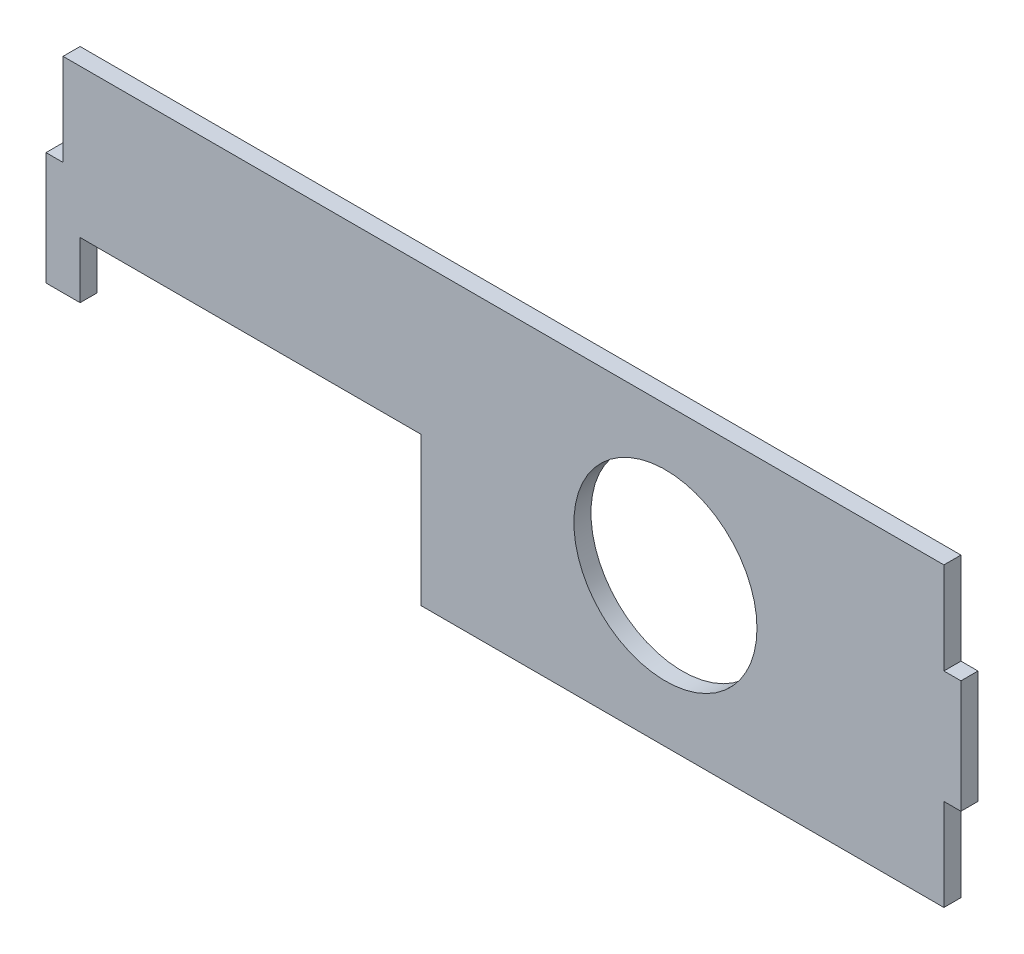
ISO-10303-21;
HEADER;
FILE_DESCRIPTION(('STEP AP214'),'2;1');
FILE_NAME('part.step','',(''),(''),'','','');
FILE_SCHEMA(('AUTOMOTIVE_DESIGN { 1 0 10303 214 1 1 1 1 }'));
ENDSEC;
DATA;
#1=APPLICATION_CONTEXT('core data for automotive mechanical design processes');
#2=APPLICATION_PROTOCOL_DEFINITION('international standard','automotive_design',2000,#1);
#3=PRODUCT_CONTEXT('',#1,'mechanical');
#4=PRODUCT('Part','Part','',(#3));
#5=PRODUCT_RELATED_PRODUCT_CATEGORY('part','',(#4));
#6=PRODUCT_DEFINITION_FORMATION('','',#4);
#7=PRODUCT_DEFINITION_CONTEXT('part definition',#1,'design');
#8=PRODUCT_DEFINITION('design','',#6,#7);
#9=PRODUCT_DEFINITION_SHAPE('','',#8);
#10=(LENGTH_UNIT() NAMED_UNIT(*) SI_UNIT(.MILLI.,.METRE.));
#11=(NAMED_UNIT(*) PLANE_ANGLE_UNIT() SI_UNIT($,.RADIAN.));
#12=(NAMED_UNIT(*) SI_UNIT($,.STERADIAN.) SOLID_ANGLE_UNIT());
#13=UNCERTAINTY_MEASURE_WITH_UNIT(LENGTH_MEASURE(1.E-05),#10,'distance_accuracy_value','');
#14=(GEOMETRIC_REPRESENTATION_CONTEXT(3) GLOBAL_UNCERTAINTY_ASSIGNED_CONTEXT((#13)) GLOBAL_UNIT_ASSIGNED_CONTEXT((#10,
#11,#12)) REPRESENTATION_CONTEXT('',''));
#15=CARTESIAN_POINT('',(0.,0.,0.));
#16=DIRECTION('',(0.,0.,1.));
#17=DIRECTION('',(1.,0.,0.));
#18=AXIS2_PLACEMENT_3D('',#15,#16,#17);
#19=CARTESIAN_POINT('',(192.200000000003,95.000000000001,3.));
#20=DIRECTION('',(0.,0.,1.));
#21=DIRECTION('',(1.,0.,0.));
#22=AXIS2_PLACEMENT_3D('',#19,#20,#21);
#23=PLANE('',#22);
#24=DIRECTION('',(1.,0.,0.));
#25=VECTOR('',#24,1.);
#26=CARTESIAN_POINT('',(136.990197314587,644.611734835916,3.));
#27=LINE('',#26,#25);
#28=CARTESIAN_POINT('',(136.990197314587,644.611734835916,3.));
#29=VERTEX_POINT('',#28);
#30=CARTESIAN_POINT('',(142.990197314587,644.611734835916,3.));
#31=VERTEX_POINT('',#30);
#32=EDGE_CURVE('E152',#29,#31,#27,.T.);
#33=ORIENTED_EDGE('',*,*,#32,.T.);
#34=DIRECTION('',(0.,-1.,0.));
#35=VECTOR('',#34,1.);
#36=CARTESIAN_POINT('',(142.990197314587,644.611734835916,3.));
#37=LINE('',#36,#35);
#38=CARTESIAN_POINT('',(142.990197314587,654.551734835916,3.));
#39=VERTEX_POINT('',#38);
#40=EDGE_CURVE('E228',#39,#31,#37,.T.);
#41=ORIENTED_EDGE('',*,*,#40,.F.);
#42=DIRECTION('',(-1.,0.,0.));
#43=VECTOR('',#42,1.);
#44=CARTESIAN_POINT('',(142.990197314587,654.551734835916,3.));
#45=LINE('',#44,#43);
#46=CARTESIAN_POINT('',(202.990197314587,654.551734835916,3.));
#47=VERTEX_POINT('',#46);
#48=EDGE_CURVE('E233',#47,#39,#45,.T.);
#49=ORIENTED_EDGE('',*,*,#48,.F.);
#50=DIRECTION('',(0.,1.,0.));
#51=VECTOR('',#50,1.);
#52=CARTESIAN_POINT('',(202.990197314587,654.551734835916,3.));
#53=LINE('',#52,#51);
#54=CARTESIAN_POINT('',(202.990197314587,628.444859835916,3.));
#55=VERTEX_POINT('',#54);
#56=EDGE_CURVE('E226',#55,#47,#53,.T.);
#57=ORIENTED_EDGE('',*,*,#56,.F.);
#58=DIRECTION('',(1.,0.,0.));
#59=VECTOR('',#58,1.);
#60=CARTESIAN_POINT('',(294.990197314587,628.444859835916,3.));
#61=LINE('',#60,#59);
#62=CARTESIAN_POINT('',(294.990197314587,628.444859835916,3.));
#63=VERTEX_POINT('',#62);
#64=EDGE_CURVE('E57',#55,#63,#61,.T.);
#65=ORIENTED_EDGE('',*,*,#64,.T.);
#66=DIRECTION('',(0.,1.,0.));
#67=VECTOR('',#66,1.);
#68=CARTESIAN_POINT('',(294.990197314587,628.444859835916,3.));
#69=LINE('',#68,#67);
#70=CARTESIAN_POINT('',(294.990197314587,644.611734835916,3.));
#71=VERTEX_POINT('',#70);
#72=EDGE_CURVE('E182',#63,#71,#69,.T.);
#73=ORIENTED_EDGE('',*,*,#72,.T.);
#74=DIRECTION('',(1.,0.,0.));
#75=VECTOR('',#74,1.);
#76=CARTESIAN_POINT('',(297.990197314587,644.611734835916,3.));
#77=LINE('',#76,#75);
#78=CARTESIAN_POINT('',(297.990197314587,644.611734835916,3.));
#79=VERTEX_POINT('',#78);
#80=EDGE_CURVE('E105',#71,#79,#77,.T.);
#81=ORIENTED_EDGE('',*,*,#80,.T.);
#82=DIRECTION('',(0.,1.,0.));
#83=VECTOR('',#82,1.);
#84=CARTESIAN_POINT('',(297.990197314587,664.491734835916,3.));
#85=LINE('',#84,#83);
#86=CARTESIAN_POINT('',(297.990197314587,664.491734835916,3.));
#87=VERTEX_POINT('',#86);
#88=EDGE_CURVE('E245',#79,#87,#85,.T.);
#89=ORIENTED_EDGE('',*,*,#88,.T.);
#90=DIRECTION('',(-1.,0.,0.));
#91=VECTOR('',#90,1.);
#92=CARTESIAN_POINT('',(294.990197314587,664.491734835916,3.));
#93=LINE('',#92,#91);
#94=CARTESIAN_POINT('',(294.990197314587,664.491734835916,3.));
#95=VERTEX_POINT('',#94);
#96=EDGE_CURVE('E247',#87,#95,#93,.T.);
#97=ORIENTED_EDGE('',*,*,#96,.T.);
#98=DIRECTION('',(0.,1.,0.));
#99=VECTOR('',#98,1.);
#100=CARTESIAN_POINT('',(294.990197314587,664.491734835916,3.));
#101=LINE('',#100,#99);
#102=CARTESIAN_POINT('',(294.990197314587,680.658609835916,3.));
#103=VERTEX_POINT('',#102);
#104=EDGE_CURVE('E249',#95,#103,#101,.T.);
#105=ORIENTED_EDGE('',*,*,#104,.T.);
#106=DIRECTION('',(-1.,0.,0.));
#107=VECTOR('',#106,1.);
#108=CARTESIAN_POINT('',(294.990197314587,680.658609835916,3.));
#109=LINE('',#108,#107);
#110=CARTESIAN_POINT('',(139.990197314587,680.658609835916,3.));
#111=VERTEX_POINT('',#110);
#112=EDGE_CURVE('E251',#103,#111,#109,.T.);
#113=ORIENTED_EDGE('',*,*,#112,.T.);
#114=DIRECTION('',(0.,-1.,0.));
#115=VECTOR('',#114,1.);
#116=CARTESIAN_POINT('',(139.990197314587,664.491734835916,3.));
#117=LINE('',#116,#115);
#118=CARTESIAN_POINT('',(139.990197314587,664.491734835916,3.));
#119=VERTEX_POINT('',#118);
#120=EDGE_CURVE('E134',#111,#119,#117,.T.);
#121=ORIENTED_EDGE('',*,*,#120,.T.);
#122=DIRECTION('',(-1.,0.,0.));
#123=VECTOR('',#122,1.);
#124=CARTESIAN_POINT('',(139.990197314587,664.491734835916,3.));
#125=LINE('',#124,#123);
#126=CARTESIAN_POINT('',(136.990197314587,664.491734835916,3.));
#127=VERTEX_POINT('',#126);
#128=EDGE_CURVE('E126',#119,#127,#125,.T.);
#129=ORIENTED_EDGE('',*,*,#128,.T.);
#130=DIRECTION('',(0.,-1.,0.));
#131=VECTOR('',#130,1.);
#132=CARTESIAN_POINT('',(136.990197314587,664.491734835916,3.));
#133=LINE('',#132,#131);
#134=EDGE_CURVE('E131',#127,#29,#133,.T.);
#135=ORIENTED_EDGE('',*,*,#134,.T.);
#136=EDGE_LOOP('',(#33,#41,#49,#57,#65,#73,#81,#89,#97,#105,#113,#121,#129,#135));
#137=FACE_BOUND('',#136,.T.);
#138=CARTESIAN_POINT('',(245.990197314587,654.551734835916,3.));
#139=DIRECTION('',(0.,0.,1.));
#140=DIRECTION('',(1.,0.,0.));
#141=AXIS2_PLACEMENT_3D('',#138,#139,#140);
#142=CIRCLE('',#141,16.1068750000001);
#143=CARTESIAN_POINT('',(262.097072314587,654.551734835916,3.));
#144=VERTEX_POINT('',#143);
#145=EDGE_CURVE('E163',#144,#144,#142,.T.);
#146=ORIENTED_EDGE('',*,*,#145,.F.);
#147=EDGE_LOOP('',(#146));
#148=FACE_BOUND('',#147,.T.);
#149=ADVANCED_FACE('F33',(#137,#148),#23,.T.);
#150=CARTESIAN_POINT('',(192.200000000003,95.000000000001,0.));
#151=DIRECTION('',(0.,0.,1.));
#152=DIRECTION('',(1.,0.,0.));
#153=AXIS2_PLACEMENT_3D('',#150,#151,#152);
#154=PLANE('',#153);
#155=DIRECTION('',(0.,-1.,0.));
#156=VECTOR('',#155,1.);
#157=CARTESIAN_POINT('',(142.990197314587,95.000000000001,0.));
#158=LINE('',#157,#156);
#159=CARTESIAN_POINT('',(142.990197314587,654.551734835916,0.));
#160=VERTEX_POINT('',#159);
#161=CARTESIAN_POINT('',(142.990197314587,644.611734835916,0.));
#162=VERTEX_POINT('',#161);
#163=EDGE_CURVE('E11',#160,#162,#158,.T.);
#164=ORIENTED_EDGE('',*,*,#163,.T.);
#165=DIRECTION('',(1.,0.,0.));
#166=VECTOR('',#165,1.);
#167=CARTESIAN_POINT('',(136.990197314587,644.611734835916,0.));
#168=LINE('',#167,#166);
#169=CARTESIAN_POINT('',(136.990197314587,644.611734835916,0.));
#170=VERTEX_POINT('',#169);
#171=EDGE_CURVE('E178',#170,#162,#168,.T.);
#172=ORIENTED_EDGE('',*,*,#171,.F.);
#173=DIRECTION('',(0.,-1.,0.));
#174=VECTOR('',#173,1.);
#175=CARTESIAN_POINT('',(136.990197314587,664.491734835916,0.));
#176=LINE('',#175,#174);
#177=CARTESIAN_POINT('',(136.990197314587,664.491734835916,0.));
#178=VERTEX_POINT('',#177);
#179=EDGE_CURVE('E176',#178,#170,#176,.T.);
#180=ORIENTED_EDGE('',*,*,#179,.F.);
#181=DIRECTION('',(-1.,0.,0.));
#182=VECTOR('',#181,1.);
#183=CARTESIAN_POINT('',(139.990197314587,664.491734835916,0.));
#184=LINE('',#183,#182);
#185=CARTESIAN_POINT('',(139.990197314587,664.491734835916,0.));
#186=VERTEX_POINT('',#185);
#187=EDGE_CURVE('E143',#186,#178,#184,.T.);
#188=ORIENTED_EDGE('',*,*,#187,.F.);
#189=DIRECTION('',(0.,-1.,0.));
#190=VECTOR('',#189,1.);
#191=CARTESIAN_POINT('',(139.990197314587,664.491734835916,0.));
#192=LINE('',#191,#190);
#193=CARTESIAN_POINT('',(139.990197314587,680.658609835916,0.));
#194=VERTEX_POINT('',#193);
#195=EDGE_CURVE('E173',#194,#186,#192,.T.);
#196=ORIENTED_EDGE('',*,*,#195,.F.);
#197=DIRECTION('',(-1.,0.,0.));
#198=VECTOR('',#197,1.);
#199=CARTESIAN_POINT('',(294.990197314587,680.658609835916,0.));
#200=LINE('',#199,#198);
#201=CARTESIAN_POINT('',(294.990197314587,680.658609835916,0.));
#202=VERTEX_POINT('',#201);
#203=EDGE_CURVE('E171',#202,#194,#200,.T.);
#204=ORIENTED_EDGE('',*,*,#203,.F.);
#205=DIRECTION('',(0.,1.,0.));
#206=VECTOR('',#205,1.);
#207=CARTESIAN_POINT('',(294.990197314587,664.491734835916,0.));
#208=LINE('',#207,#206);
#209=CARTESIAN_POINT('',(294.990197314587,664.491734835916,0.));
#210=VERTEX_POINT('',#209);
#211=EDGE_CURVE('E169',#210,#202,#208,.T.);
#212=ORIENTED_EDGE('',*,*,#211,.F.);
#213=DIRECTION('',(-1.,0.,0.));
#214=VECTOR('',#213,1.);
#215=CARTESIAN_POINT('',(294.990197314587,664.491734835916,0.));
#216=LINE('',#215,#214);
#217=CARTESIAN_POINT('',(297.990197314587,664.491734835916,0.));
#218=VERTEX_POINT('',#217);
#219=EDGE_CURVE('E167',#218,#210,#216,.T.);
#220=ORIENTED_EDGE('',*,*,#219,.F.);
#221=DIRECTION('',(0.,1.,0.));
#222=VECTOR('',#221,1.);
#223=CARTESIAN_POINT('',(297.990197314587,664.491734835916,0.));
#224=LINE('',#223,#222);
#225=CARTESIAN_POINT('',(297.990197314587,644.611734835916,0.));
#226=VERTEX_POINT('',#225);
#227=EDGE_CURVE('E165',#226,#218,#224,.T.);
#228=ORIENTED_EDGE('',*,*,#227,.F.);
#229=DIRECTION('',(1.,0.,0.));
#230=VECTOR('',#229,1.);
#231=CARTESIAN_POINT('',(297.990197314587,644.611734835916,0.));
#232=LINE('',#231,#230);
#233=CARTESIAN_POINT('',(294.990197314587,644.611734835916,0.));
#234=VERTEX_POINT('',#233);
#235=EDGE_CURVE('E162',#234,#226,#232,.T.);
#236=ORIENTED_EDGE('',*,*,#235,.F.);
#237=DIRECTION('',(0.,1.,0.));
#238=VECTOR('',#237,1.);
#239=CARTESIAN_POINT('',(294.990197314587,628.444859835916,0.));
#240=LINE('',#239,#238);
#241=CARTESIAN_POINT('',(294.990197314587,628.444859835916,0.));
#242=VERTEX_POINT('',#241);
#243=EDGE_CURVE('E159',#242,#234,#240,.T.);
#244=ORIENTED_EDGE('',*,*,#243,.F.);
#245=DIRECTION('',(1.,0.,0.));
#246=VECTOR('',#245,1.);
#247=CARTESIAN_POINT('',(294.990197314587,628.444859835916,0.));
#248=LINE('',#247,#246);
#249=CARTESIAN_POINT('',(202.990197314587,628.444859835916,0.));
#250=VERTEX_POINT('',#249);
#251=EDGE_CURVE('E96',#250,#242,#248,.T.);
#252=ORIENTED_EDGE('',*,*,#251,.F.);
#253=DIRECTION('',(0.,1.,0.));
#254=VECTOR('',#253,1.);
#255=CARTESIAN_POINT('',(202.990197314587,95.000000000001,0.));
#256=LINE('',#255,#254);
#257=CARTESIAN_POINT('',(202.990197314587,654.551734835916,0.));
#258=VERTEX_POINT('',#257);
#259=EDGE_CURVE('E48',#250,#258,#256,.T.);
#260=ORIENTED_EDGE('',*,*,#259,.T.);
#261=DIRECTION('',(-1.,0.,0.));
#262=VECTOR('',#261,1.);
#263=CARTESIAN_POINT('',(192.200000000003,654.551734835916,0.));
#264=LINE('',#263,#262);
#265=EDGE_CURVE('E41',#258,#160,#264,.T.);
#266=ORIENTED_EDGE('',*,*,#265,.T.);
#267=EDGE_LOOP('',(#164,#172,#180,#188,#196,#204,#212,#220,#228,#236,#244,#252,#260,#266));
#268=FACE_BOUND('',#267,.T.);
#269=CARTESIAN_POINT('',(245.990197314587,654.551734835916,0.));
#270=DIRECTION('',(0.,0.,1.));
#271=DIRECTION('',(1.,0.,0.));
#272=AXIS2_PLACEMENT_3D('',#269,#270,#271);
#273=CIRCLE('',#272,16.1068750000001);
#274=CARTESIAN_POINT('',(262.097072314587,654.551734835916,0.));
#275=VERTEX_POINT('',#274);
#276=EDGE_CURVE('E238',#275,#275,#273,.T.);
#277=ORIENTED_EDGE('',*,*,#276,.T.);
#278=EDGE_LOOP('',(#277));
#279=FACE_BOUND('',#278,.T.);
#280=ADVANCED_FACE('F207',(#268,#279),#154,.F.);
#281=CARTESIAN_POINT('',(294.990197314587,628.444859835916,3.));
#282=DIRECTION('',(-1.,0.,0.));
#283=DIRECTION('',(0.,-1.,0.));
#284=AXIS2_PLACEMENT_3D('',#281,#282,#283);
#285=PLANE('',#284);
#286=ORIENTED_EDGE('',*,*,#243,.T.);
#287=DIRECTION('',(0.,0.,-1.));
#288=VECTOR('',#287,1.);
#289=CARTESIAN_POINT('',(294.990197314587,644.611734835916,3.));
#290=LINE('',#289,#288);
#291=EDGE_CURVE('E201',#71,#234,#290,.T.);
#292=ORIENTED_EDGE('',*,*,#291,.F.);
#293=ORIENTED_EDGE('',*,*,#72,.F.);
#294=DIRECTION('',(0.,0.,-1.));
#295=VECTOR('',#294,1.);
#296=CARTESIAN_POINT('',(294.990197314587,628.444859835916,3.));
#297=LINE('',#296,#295);
#298=EDGE_CURVE('E158',#63,#242,#297,.T.);
#299=ORIENTED_EDGE('',*,*,#298,.T.);
#300=EDGE_LOOP('',(#286,#292,#293,#299));
#301=FACE_BOUND('',#300,.T.);
#302=ADVANCED_FACE('F35',(#301),#285,.F.);
#303=CARTESIAN_POINT('',(297.990197314587,644.611734835916,3.));
#304=DIRECTION('',(0.,1.,0.));
#305=DIRECTION('',(0.,0.,1.));
#306=AXIS2_PLACEMENT_3D('',#303,#304,#305);
#307=PLANE('',#306);
#308=ORIENTED_EDGE('',*,*,#235,.T.);
#309=DIRECTION('',(0.,0.,-1.));
#310=VECTOR('',#309,1.);
#311=CARTESIAN_POINT('',(297.990197314587,644.611734835916,3.));
#312=LINE('',#311,#310);
#313=EDGE_CURVE('E198',#79,#226,#312,.T.);
#314=ORIENTED_EDGE('',*,*,#313,.F.);
#315=ORIENTED_EDGE('',*,*,#80,.F.);
#316=ORIENTED_EDGE('',*,*,#291,.T.);
#317=EDGE_LOOP('',(#308,#314,#315,#316));
#318=FACE_BOUND('',#317,.T.);
#319=ADVANCED_FACE('F281',(#318),#307,.F.);
#320=CARTESIAN_POINT('',(297.990197314587,664.491734835916,3.));
#321=DIRECTION('',(-1.,0.,0.));
#322=DIRECTION('',(0.,0.,1.));
#323=AXIS2_PLACEMENT_3D('',#320,#321,#322);
#324=PLANE('',#323);
#325=ORIENTED_EDGE('',*,*,#227,.T.);
#326=DIRECTION('',(0.,0.,-1.));
#327=VECTOR('',#326,1.);
#328=CARTESIAN_POINT('',(297.990197314587,664.491734835916,3.));
#329=LINE('',#328,#327);
#330=EDGE_CURVE('E195',#87,#218,#329,.T.);
#331=ORIENTED_EDGE('',*,*,#330,.F.);
#332=ORIENTED_EDGE('',*,*,#88,.F.);
#333=ORIENTED_EDGE('',*,*,#313,.T.);
#334=EDGE_LOOP('',(#325,#331,#332,#333));
#335=FACE_BOUND('',#334,.T.);
#336=ADVANCED_FACE('F284',(#335),#324,.F.);
#337=CARTESIAN_POINT('',(294.990197314587,664.491734835916,3.));
#338=DIRECTION('',(0.,-1.,0.));
#339=DIRECTION('',(0.,0.,-1.));
#340=AXIS2_PLACEMENT_3D('',#337,#338,#339);
#341=PLANE('',#340);
#342=ORIENTED_EDGE('',*,*,#219,.T.);
#343=DIRECTION('',(0.,0.,-1.));
#344=VECTOR('',#343,1.);
#345=CARTESIAN_POINT('',(294.990197314587,664.491734835916,3.));
#346=LINE('',#345,#344);
#347=EDGE_CURVE('E192',#95,#210,#346,.T.);
#348=ORIENTED_EDGE('',*,*,#347,.F.);
#349=ORIENTED_EDGE('',*,*,#96,.F.);
#350=ORIENTED_EDGE('',*,*,#330,.T.);
#351=EDGE_LOOP('',(#342,#348,#349,#350));
#352=FACE_BOUND('',#351,.T.);
#353=ADVANCED_FACE('F289',(#352),#341,.F.);
#354=CARTESIAN_POINT('',(294.990197314587,664.491734835916,3.));
#355=DIRECTION('',(-1.,0.,0.));
#356=DIRECTION('',(0.,0.,1.));
#357=AXIS2_PLACEMENT_3D('',#354,#355,#356);
#358=PLANE('',#357);
#359=ORIENTED_EDGE('',*,*,#211,.T.);
#360=DIRECTION('',(0.,0.,-1.));
#361=VECTOR('',#360,1.);
#362=CARTESIAN_POINT('',(294.990197314587,680.658609835916,3.));
#363=LINE('',#362,#361);
#364=EDGE_CURVE('E189',#103,#202,#363,.T.);
#365=ORIENTED_EDGE('',*,*,#364,.F.);
#366=ORIENTED_EDGE('',*,*,#104,.F.);
#367=ORIENTED_EDGE('',*,*,#347,.T.);
#368=EDGE_LOOP('',(#359,#365,#366,#367));
#369=FACE_BOUND('',#368,.T.);
#370=ADVANCED_FACE('F292',(#369),#358,.F.);
#371=CARTESIAN_POINT('',(294.990197314587,680.658609835916,3.));
#372=DIRECTION('',(0.,-1.,0.));
#373=DIRECTION('',(0.,0.,-1.));
#374=AXIS2_PLACEMENT_3D('',#371,#372,#373);
#375=PLANE('',#374);
#376=ORIENTED_EDGE('',*,*,#203,.T.);
#377=DIRECTION('',(0.,0.,-1.));
#378=VECTOR('',#377,1.);
#379=CARTESIAN_POINT('',(139.990197314587,680.658609835916,3.));
#380=LINE('',#379,#378);
#381=EDGE_CURVE('E186',#111,#194,#380,.T.);
#382=ORIENTED_EDGE('',*,*,#381,.F.);
#383=ORIENTED_EDGE('',*,*,#112,.F.);
#384=ORIENTED_EDGE('',*,*,#364,.T.);
#385=EDGE_LOOP('',(#376,#382,#383,#384));
#386=FACE_BOUND('',#385,.T.);
#387=ADVANCED_FACE('F257',(#386),#375,.F.);
#388=CARTESIAN_POINT('',(139.990197314587,664.491734835916,3.));
#389=DIRECTION('',(1.,0.,0.));
#390=DIRECTION('',(0.,0.,-1.));
#391=AXIS2_PLACEMENT_3D('',#388,#389,#390);
#392=PLANE('',#391);
#393=ORIENTED_EDGE('',*,*,#195,.T.);
#394=DIRECTION('',(0.,0.,-1.));
#395=VECTOR('',#394,1.);
#396=CARTESIAN_POINT('',(139.990197314587,664.491734835916,3.));
#397=LINE('',#396,#395);
#398=EDGE_CURVE('E146',#119,#186,#397,.T.);
#399=ORIENTED_EDGE('',*,*,#398,.F.);
#400=ORIENTED_EDGE('',*,*,#120,.F.);
#401=ORIENTED_EDGE('',*,*,#381,.T.);
#402=EDGE_LOOP('',(#393,#399,#400,#401));
#403=FACE_BOUND('',#402,.T.);
#404=ADVANCED_FACE('F261',(#403),#392,.F.);
#405=CARTESIAN_POINT('',(139.990197314587,664.491734835916,3.));
#406=DIRECTION('',(0.,-1.,0.));
#407=DIRECTION('',(0.,0.,-1.));
#408=AXIS2_PLACEMENT_3D('',#405,#406,#407);
#409=PLANE('',#408);
#410=ORIENTED_EDGE('',*,*,#187,.T.);
#411=DIRECTION('',(0.,0.,-1.));
#412=VECTOR('',#411,1.);
#413=CARTESIAN_POINT('',(136.990197314587,664.491734835916,3.));
#414=LINE('',#413,#412);
#415=EDGE_CURVE('E140',#127,#178,#414,.T.);
#416=ORIENTED_EDGE('',*,*,#415,.F.);
#417=ORIENTED_EDGE('',*,*,#128,.F.);
#418=ORIENTED_EDGE('',*,*,#398,.T.);
#419=EDGE_LOOP('',(#410,#416,#417,#418));
#420=FACE_BOUND('',#419,.T.);
#421=ADVANCED_FACE('F141',(#420),#409,.F.);
#422=CARTESIAN_POINT('',(136.990197314587,664.491734835916,3.));
#423=DIRECTION('',(1.,0.,0.));
#424=DIRECTION('',(0.,0.,-1.));
#425=AXIS2_PLACEMENT_3D('',#422,#423,#424);
#426=PLANE('',#425);
#427=ORIENTED_EDGE('',*,*,#179,.T.);
#428=DIRECTION('',(0.,0.,-1.));
#429=VECTOR('',#428,1.);
#430=CARTESIAN_POINT('',(136.990197314587,644.611734835916,3.));
#431=LINE('',#430,#429);
#432=EDGE_CURVE('E147',#29,#170,#431,.T.);
#433=ORIENTED_EDGE('',*,*,#432,.F.);
#434=ORIENTED_EDGE('',*,*,#134,.F.);
#435=ORIENTED_EDGE('',*,*,#415,.T.);
#436=EDGE_LOOP('',(#427,#433,#434,#435));
#437=FACE_BOUND('',#436,.T.);
#438=ADVANCED_FACE('F149',(#437),#426,.F.);
#439=CARTESIAN_POINT('',(136.990197314587,644.611734835916,3.));
#440=DIRECTION('',(0.,1.,0.));
#441=DIRECTION('',(0.,0.,1.));
#442=AXIS2_PLACEMENT_3D('',#439,#440,#441);
#443=PLANE('',#442);
#444=ORIENTED_EDGE('',*,*,#171,.T.);
#445=DIRECTION('',(0.,0.,1.));
#446=VECTOR('',#445,1.);
#447=CARTESIAN_POINT('',(142.990197314587,644.611734835916,-5.00000000001367E-05));
#448=LINE('',#447,#446);
#449=EDGE_CURVE('E230',#162,#31,#448,.T.);
#450=ORIENTED_EDGE('',*,*,#449,.T.);
#451=ORIENTED_EDGE('',*,*,#32,.F.);
#452=ORIENTED_EDGE('',*,*,#432,.T.);
#453=EDGE_LOOP('',(#444,#450,#451,#452));
#454=FACE_BOUND('',#453,.T.);
#455=ADVANCED_FACE('F263',(#454),#443,.F.);
#456=CARTESIAN_POINT('',(294.990197314587,628.444859835916,3.));
#457=DIRECTION('',(0.,1.,0.));
#458=DIRECTION('',(0.,0.,1.));
#459=AXIS2_PLACEMENT_3D('',#456,#457,#458);
#460=PLANE('',#459);
#461=ORIENTED_EDGE('',*,*,#64,.F.);
#462=DIRECTION('',(0.,0.,-1.));
#463=VECTOR('',#462,1.);
#464=CARTESIAN_POINT('',(202.990197314587,628.444859835916,3.));
#465=LINE('',#464,#463);
#466=EDGE_CURVE('E203',#55,#250,#465,.T.);
#467=ORIENTED_EDGE('',*,*,#466,.T.);
#468=ORIENTED_EDGE('',*,*,#251,.T.);
#469=ORIENTED_EDGE('',*,*,#298,.F.);
#470=EDGE_LOOP('',(#461,#467,#468,#469));
#471=FACE_BOUND('',#470,.T.);
#472=ADVANCED_FACE('F274',(#471),#460,.F.);
#473=CARTESIAN_POINT('',(245.990197314587,654.551734835916,3.));
#474=DIRECTION('',(0.,0.,-1.));
#475=DIRECTION('',(-1.,0.,0.));
#476=AXIS2_PLACEMENT_3D('',#473,#474,#475);
#477=CYLINDRICAL_SURFACE('',#476,16.1068750000001);
#478=ORIENTED_EDGE('',*,*,#145,.T.);
#479=EDGE_LOOP('',(#478));
#480=FACE_BOUND('',#479,.T.);
#481=ORIENTED_EDGE('',*,*,#276,.F.);
#482=EDGE_LOOP('',(#481));
#483=FACE_BOUND('',#482,.T.);
#484=ADVANCED_FACE('F308',(#480,#483),#477,.F.);
#485=CARTESIAN_POINT('',(142.990197314587,644.611734835916,-5.00000000001367E-05));
#486=DIRECTION('',(-1.,0.,0.));
#487=DIRECTION('',(0.,0.,1.));
#488=AXIS2_PLACEMENT_3D('',#485,#486,#487);
#489=PLANE('',#488);
#490=DIRECTION('',(0.,0.,1.));
#491=VECTOR('',#490,1.);
#492=CARTESIAN_POINT('',(142.990197314587,654.551734835916,-5.00000000001367E-05));
#493=LINE('',#492,#491);
#494=EDGE_CURVE('E222',#160,#39,#493,.T.);
#495=ORIENTED_EDGE('',*,*,#494,.T.);
#496=ORIENTED_EDGE('',*,*,#40,.T.);
#497=ORIENTED_EDGE('',*,*,#449,.F.);
#498=ORIENTED_EDGE('',*,*,#163,.F.);
#499=EDGE_LOOP('',(#495,#496,#497,#498));
#500=FACE_BOUND('',#499,.T.);
#501=ADVANCED_FACE('F351',(#500),#489,.F.);
#502=CARTESIAN_POINT('',(142.990197314587,654.551734835916,-5.00000000001367E-05));
#503=DIRECTION('',(0.,1.,0.));
#504=DIRECTION('',(0.,0.,1.));
#505=AXIS2_PLACEMENT_3D('',#502,#503,#504);
#506=PLANE('',#505);
#507=DIRECTION('',(0.,0.,1.));
#508=VECTOR('',#507,1.);
#509=CARTESIAN_POINT('',(202.990197314587,654.551734835916,-5.00000000001367E-05));
#510=LINE('',#509,#508);
#511=EDGE_CURVE('E219',#258,#47,#510,.T.);
#512=ORIENTED_EDGE('',*,*,#511,.T.);
#513=ORIENTED_EDGE('',*,*,#48,.T.);
#514=ORIENTED_EDGE('',*,*,#494,.F.);
#515=ORIENTED_EDGE('',*,*,#265,.F.);
#516=EDGE_LOOP('',(#512,#513,#514,#515));
#517=FACE_BOUND('',#516,.T.);
#518=ADVANCED_FACE('F216',(#517),#506,.F.);
#519=CARTESIAN_POINT('',(202.990197314587,654.551734835916,-5.00000000001367E-05));
#520=DIRECTION('',(1.,0.,0.));
#521=DIRECTION('',(0.,1.,0.));
#522=AXIS2_PLACEMENT_3D('',#519,#520,#521);
#523=PLANE('',#522);
#524=ORIENTED_EDGE('',*,*,#466,.F.);
#525=ORIENTED_EDGE('',*,*,#56,.T.);
#526=ORIENTED_EDGE('',*,*,#511,.F.);
#527=ORIENTED_EDGE('',*,*,#259,.F.);
#528=EDGE_LOOP('',(#524,#525,#526,#527));
#529=FACE_BOUND('',#528,.T.);
#530=ADVANCED_FACE('F225',(#529),#523,.F.);
#531=CLOSED_SHELL('',(#149,#280,#302,#319,#336,#353,#370,#387,#404,#421,#438,#455,#472,#484,
#501,#518,#530));
#532=MANIFOLD_SOLID_BREP('B2',#531);
#533=ADVANCED_BREP_SHAPE_REPRESENTATION('',(#18,#532),#14);
#534=SHAPE_DEFINITION_REPRESENTATION(#9,#533);
ENDSEC;
END-ISO-10303-21;
